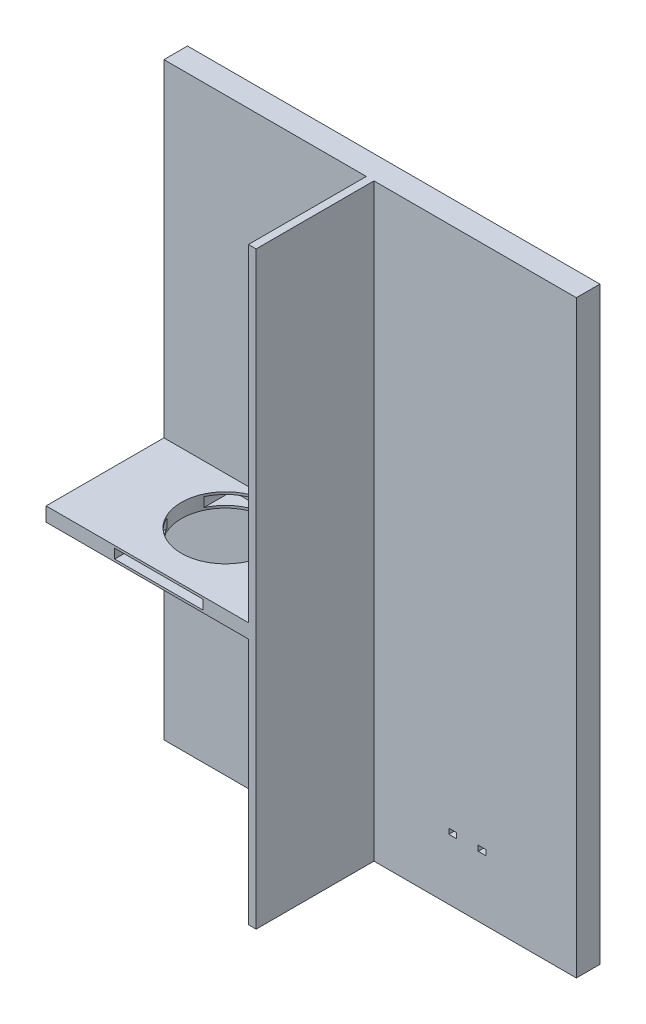
ISO-10303-21;
HEADER;
FILE_DESCRIPTION(('STEP AP214'),'2;1');
FILE_NAME('part.step','',(''),(''),'','','');
FILE_SCHEMA(('AUTOMOTIVE_DESIGN { 1 0 10303 214 1 1 1 1 }'));
ENDSEC;
DATA;
#1=APPLICATION_CONTEXT('core data for automotive mechanical design processes');
#2=APPLICATION_PROTOCOL_DEFINITION('international standard','automotive_design',2000,#1);
#3=PRODUCT_CONTEXT('',#1,'mechanical');
#4=PRODUCT('Part','Part','',(#3));
#5=PRODUCT_RELATED_PRODUCT_CATEGORY('part','',(#4));
#6=PRODUCT_DEFINITION_FORMATION('','',#4);
#7=PRODUCT_DEFINITION_CONTEXT('part definition',#1,'design');
#8=PRODUCT_DEFINITION('design','',#6,#7);
#9=PRODUCT_DEFINITION_SHAPE('','',#8);
#10=(LENGTH_UNIT() NAMED_UNIT(*) SI_UNIT(.MILLI.,.METRE.));
#11=(NAMED_UNIT(*) PLANE_ANGLE_UNIT() SI_UNIT($,.RADIAN.));
#12=(NAMED_UNIT(*) SI_UNIT($,.STERADIAN.) SOLID_ANGLE_UNIT());
#13=UNCERTAINTY_MEASURE_WITH_UNIT(LENGTH_MEASURE(1.E-05),#10,'distance_accuracy_value','');
#14=(GEOMETRIC_REPRESENTATION_CONTEXT(3) GLOBAL_UNCERTAINTY_ASSIGNED_CONTEXT((#13)) GLOBAL_UNIT_ASSIGNED_CONTEXT((#10,
#11,#12)) REPRESENTATION_CONTEXT('',''));
#15=CARTESIAN_POINT('',(0.,0.,0.));
#16=DIRECTION('',(0.,0.,1.));
#17=DIRECTION('',(1.,0.,0.));
#18=AXIS2_PLACEMENT_3D('',#15,#16,#17);
#19=CARTESIAN_POINT('',(5.82,21.2,2.));
#20=DIRECTION('',(-1.,0.,0.));
#21=DIRECTION('',(0.,0.,1.));
#22=AXIS2_PLACEMENT_3D('',#19,#20,#21);
#23=PLANE('',#22);
#24=DIRECTION('',(0.,0.,1.));
#25=VECTOR('',#24,1.);
#26=CARTESIAN_POINT('',(5.82,22.,2.));
#27=LINE('',#26,#25);
#28=CARTESIAN_POINT('',(5.82,22.,2.));
#29=VERTEX_POINT('',#28);
#30=CARTESIAN_POINT('',(5.82,22.,4.42851427794878));
#31=VERTEX_POINT('',#30);
#32=EDGE_CURVE('E273',#29,#31,#27,.T.);
#33=ORIENTED_EDGE('',*,*,#32,.T.);
#34=DIRECTION('',(0.,-1.,0.));
#35=VECTOR('',#34,1.);
#36=CARTESIAN_POINT('',(5.82,50.001,4.42851427794878));
#37=LINE('',#36,#35);
#38=CARTESIAN_POINT('',(5.82,21.2,4.42851427794879));
#39=VERTEX_POINT('',#38);
#40=EDGE_CURVE('E262',#39,#31,#37,.F.);
#41=ORIENTED_EDGE('',*,*,#40,.F.);
#42=DIRECTION('',(0.,0.,1.));
#43=VECTOR('',#42,1.);
#44=CARTESIAN_POINT('',(5.82,21.2,2.));
#45=LINE('',#44,#43);
#46=CARTESIAN_POINT('',(5.82,21.2,2.));
#47=VERTEX_POINT('',#46);
#48=EDGE_CURVE('E271',#47,#39,#45,.T.);
#49=ORIENTED_EDGE('',*,*,#48,.F.);
#50=DIRECTION('',(0.,-1.,0.));
#51=VECTOR('',#50,1.);
#52=CARTESIAN_POINT('',(5.82,21.2,2.));
#53=LINE('',#52,#51);
#54=EDGE_CURVE('E615',#29,#47,#53,.T.);
#55=ORIENTED_EDGE('',*,*,#54,.F.);
#56=EDGE_LOOP('',(#33,#41,#49,#55));
#57=FACE_BOUND('',#56,.T.);
#58=ADVANCED_FACE('F38',(#57),#23,.F.);
#59=CARTESIAN_POINT('',(0.,0.,2.));
#60=DIRECTION('',(0.,0.,-1.));
#61=DIRECTION('',(-1.,0.,0.));
#62=AXIS2_PLACEMENT_3D('',#59,#60,#61);
#63=PLANE('',#62);
#64=DIRECTION('',(1.,0.,0.));
#65=VECTOR('',#64,1.);
#66=CARTESIAN_POINT('',(0.,22.2,2.));
#67=LINE('',#66,#65);
#68=CARTESIAN_POINT('',(0.,22.2,2.));
#69=VERTEX_POINT('',#68);
#70=CARTESIAN_POINT('',(17.175,22.2,2.));
#71=VERTEX_POINT('',#70);
#72=EDGE_CURVE('E314',#69,#71,#67,.T.);
#73=ORIENTED_EDGE('',*,*,#72,.T.);
#74=DIRECTION('',(0.,-1.,0.));
#75=VECTOR('',#74,1.);
#76=CARTESIAN_POINT('',(17.175,50.,2.));
#77=LINE('',#76,#75);
#78=CARTESIAN_POINT('',(17.175,50.,2.));
#79=VERTEX_POINT('',#78);
#80=EDGE_CURVE('E327',#79,#71,#77,.T.);
#81=ORIENTED_EDGE('',*,*,#80,.F.);
#82=DIRECTION('',(-1.,0.,0.));
#83=VECTOR('',#82,1.);
#84=CARTESIAN_POINT('',(0.,50.,2.));
#85=LINE('',#84,#83);
#86=CARTESIAN_POINT('',(0.,50.,2.));
#87=VERTEX_POINT('',#86);
#88=EDGE_CURVE('E547',#79,#87,#85,.T.);
#89=ORIENTED_EDGE('',*,*,#88,.T.);
#90=DIRECTION('',(0.,-1.,0.));
#91=VECTOR('',#90,1.);
#92=CARTESIAN_POINT('',(0.,0.,2.));
#93=LINE('',#92,#91);
#94=EDGE_CURVE('E534',#87,#69,#93,.T.);
#95=ORIENTED_EDGE('',*,*,#94,.T.);
#96=EDGE_LOOP('',(#73,#81,#89,#95));
#97=FACE_BOUND('',#96,.T.);
#98=ADVANCED_FACE('F595',(#97),#63,.F.);
#99=DIRECTION('',(0.,1.,0.));
#100=VECTOR('',#99,1.);
#101=CARTESIAN_POINT('',(8.6,5.40342989584691,2.));
#102=LINE('',#101,#100);
#103=CARTESIAN_POINT('',(8.6,5.40342989584691,2.));
#104=VERTEX_POINT('',#103);
#105=CARTESIAN_POINT('',(8.6,6.00342989584691,2.));
#106=VERTEX_POINT('',#105);
#107=EDGE_CURVE('E491',#104,#106,#102,.T.);
#108=ORIENTED_EDGE('',*,*,#107,.F.);
#109=DIRECTION('',(1.,0.,0.));
#110=VECTOR('',#109,1.);
#111=CARTESIAN_POINT('',(8.,5.40342989584691,2.));
#112=LINE('',#111,#110);
#113=CARTESIAN_POINT('',(8.,5.40342989584691,2.));
#114=VERTEX_POINT('',#113);
#115=EDGE_CURVE('E502',#114,#104,#112,.T.);
#116=ORIENTED_EDGE('',*,*,#115,.F.);
#117=DIRECTION('',(0.,-1.,0.));
#118=VECTOR('',#117,1.);
#119=CARTESIAN_POINT('',(8.,5.40342989584691,2.));
#120=LINE('',#119,#118);
#121=CARTESIAN_POINT('',(8.,6.00342989584691,2.));
#122=VERTEX_POINT('',#121);
#123=EDGE_CURVE('E498',#122,#114,#120,.T.);
#124=ORIENTED_EDGE('',*,*,#123,.F.);
#125=DIRECTION('',(-1.,0.,0.));
#126=VECTOR('',#125,1.);
#127=CARTESIAN_POINT('',(8.,6.00342989584691,2.));
#128=LINE('',#127,#126);
#129=EDGE_CURVE('E494',#106,#122,#128,.T.);
#130=ORIENTED_EDGE('',*,*,#129,.F.);
#131=EDGE_LOOP('',(#108,#116,#124,#130));
#132=FACE_BOUND('',#131,.T.);
#133=DIRECTION('',(0.,-1.,0.));
#134=VECTOR('',#133,1.);
#135=CARTESIAN_POINT('',(10.54,6.00342989584691,2.));
#136=LINE('',#135,#134);
#137=CARTESIAN_POINT('',(10.54,6.00342989584691,2.));
#138=VERTEX_POINT('',#137);
#139=CARTESIAN_POINT('',(10.54,5.40342989584691,2.));
#140=VERTEX_POINT('',#139);
#141=EDGE_CURVE('E448',#138,#140,#136,.T.);
#142=ORIENTED_EDGE('',*,*,#141,.F.);
#143=DIRECTION('',(-1.,0.,0.));
#144=VECTOR('',#143,1.);
#145=CARTESIAN_POINT('',(11.14,6.00342989584691,2.));
#146=LINE('',#145,#144);
#147=CARTESIAN_POINT('',(11.14,6.00342989584691,2.));
#148=VERTEX_POINT('',#147);
#149=EDGE_CURVE('E459',#148,#138,#146,.T.);
#150=ORIENTED_EDGE('',*,*,#149,.F.);
#151=DIRECTION('',(0.,1.,0.));
#152=VECTOR('',#151,1.);
#153=CARTESIAN_POINT('',(11.14,6.00342989584691,2.));
#154=LINE('',#153,#152);
#155=CARTESIAN_POINT('',(11.14,5.40342989584691,2.));
#156=VERTEX_POINT('',#155);
#157=EDGE_CURVE('E455',#156,#148,#154,.T.);
#158=ORIENTED_EDGE('',*,*,#157,.F.);
#159=DIRECTION('',(1.,0.,0.));
#160=VECTOR('',#159,1.);
#161=CARTESIAN_POINT('',(11.14,5.40342989584691,2.));
#162=LINE('',#161,#160);
#163=EDGE_CURVE('E451',#140,#156,#162,.T.);
#164=ORIENTED_EDGE('',*,*,#163,.F.);
#165=EDGE_LOOP('',(#142,#150,#158,#164));
#166=FACE_BOUND('',#165,.T.);
#167=DIRECTION('',(1.,0.,0.));
#168=VECTOR('',#167,1.);
#169=CARTESIAN_POINT('',(0.,21.,2.));
#170=LINE('',#169,#168);
#171=CARTESIAN_POINT('',(0.,21.,2.));
#172=VERTEX_POINT('',#171);
#173=CARTESIAN_POINT('',(17.175,21.,2.));
#174=VERTEX_POINT('',#173);
#175=EDGE_CURVE('E311',#172,#174,#170,.T.);
#176=ORIENTED_EDGE('',*,*,#175,.F.);
#177=CARTESIAN_POINT('',(0.,0.,2.));
#178=VERTEX_POINT('',#177);
#179=EDGE_CURVE('E539',#172,#178,#93,.T.);
#180=ORIENTED_EDGE('',*,*,#179,.T.);
#181=DIRECTION('',(1.,0.,0.));
#182=VECTOR('',#181,1.);
#183=CARTESIAN_POINT('',(0.,0.,2.));
#184=LINE('',#183,#182);
#185=CARTESIAN_POINT('',(17.175,0.,2.));
#186=VERTEX_POINT('',#185);
#187=EDGE_CURVE('E540',#178,#186,#184,.T.);
#188=ORIENTED_EDGE('',*,*,#187,.T.);
#189=EDGE_CURVE('E342',#174,#186,#77,.T.);
#190=ORIENTED_EDGE('',*,*,#189,.F.);
#191=EDGE_LOOP('',(#176,#180,#188,#190));
#192=FACE_BOUND('',#191,.T.);
#193=ADVANCED_FACE('F685',(#132,#166,#192),#63,.F.);
#194=CARTESIAN_POINT('',(17.175,50.,12.));
#195=DIRECTION('',(1.,0.,0.));
#196=DIRECTION('',(0.,1.,0.));
#197=AXIS2_PLACEMENT_3D('',#194,#195,#196);
#198=PLANE('',#197);
#199=DIRECTION('',(0.,0.,-1.));
#200=VECTOR('',#199,1.);
#201=CARTESIAN_POINT('',(17.175,22.2,12.));
#202=LINE('',#201,#200);
#203=CARTESIAN_POINT('',(17.175,22.2,12.));
#204=VERTEX_POINT('',#203);
#205=EDGE_CURVE('E303',#204,#71,#202,.T.);
#206=ORIENTED_EDGE('',*,*,#205,.F.);
#207=DIRECTION('',(0.,-1.,0.));
#208=VECTOR('',#207,1.);
#209=CARTESIAN_POINT('',(17.175,50.,12.));
#210=LINE('',#209,#208);
#211=CARTESIAN_POINT('',(17.175,50.,12.));
#212=VERTEX_POINT('',#211);
#213=EDGE_CURVE('E331',#212,#204,#210,.T.);
#214=ORIENTED_EDGE('',*,*,#213,.F.);
#215=DIRECTION('',(0.,0.,-1.));
#216=VECTOR('',#215,1.);
#217=CARTESIAN_POINT('',(17.175,50.,12.));
#218=LINE('',#217,#216);
#219=EDGE_CURVE('E353',#212,#79,#218,.T.);
#220=ORIENTED_EDGE('',*,*,#219,.T.);
#221=ORIENTED_EDGE('',*,*,#80,.T.);
#222=EDGE_LOOP('',(#206,#214,#220,#221));
#223=FACE_BOUND('',#222,.T.);
#224=ADVANCED_FACE('F681',(#223),#198,.F.);
#225=DIRECTION('',(0.,0.,1.));
#226=VECTOR('',#225,1.);
#227=CARTESIAN_POINT('',(17.175,21.,12.));
#228=LINE('',#227,#226);
#229=CARTESIAN_POINT('',(17.175,21.,12.));
#230=VERTEX_POINT('',#229);
#231=EDGE_CURVE('E296',#174,#230,#228,.T.);
#232=ORIENTED_EDGE('',*,*,#231,.F.);
#233=ORIENTED_EDGE('',*,*,#189,.T.);
#234=DIRECTION('',(0.,0.,-1.));
#235=VECTOR('',#234,1.);
#236=CARTESIAN_POINT('',(17.175,0.,12.));
#237=LINE('',#236,#235);
#238=CARTESIAN_POINT('',(17.175,0.,12.));
#239=VERTEX_POINT('',#238);
#240=EDGE_CURVE('E349',#239,#186,#237,.T.);
#241=ORIENTED_EDGE('',*,*,#240,.F.);
#242=EDGE_CURVE('E330',#230,#239,#210,.T.);
#243=ORIENTED_EDGE('',*,*,#242,.F.);
#244=EDGE_LOOP('',(#232,#233,#241,#243));
#245=FACE_BOUND('',#244,.T.);
#246=ADVANCED_FACE('F684',(#245),#198,.F.);
#247=DIRECTION('',(0.,-1.,0.));
#248=VECTOR('',#247,1.);
#249=CARTESIAN_POINT('',(24.175,5.15,2.));
#250=LINE('',#249,#248);
#251=CARTESIAN_POINT('',(24.175,5.6,2.));
#252=VERTEX_POINT('',#251);
#253=CARTESIAN_POINT('',(24.175,5.15,2.));
#254=VERTEX_POINT('',#253);
#255=EDGE_CURVE('E362',#252,#254,#250,.T.);
#256=ORIENTED_EDGE('',*,*,#255,.F.);
#257=DIRECTION('',(-1.,0.,0.));
#258=VECTOR('',#257,1.);
#259=CARTESIAN_POINT('',(24.825,5.6,2.));
#260=LINE('',#259,#258);
#261=CARTESIAN_POINT('',(24.825,5.6,2.));
#262=VERTEX_POINT('',#261);
#263=EDGE_CURVE('E373',#262,#252,#260,.T.);
#264=ORIENTED_EDGE('',*,*,#263,.F.);
#265=DIRECTION('',(0.,1.,0.));
#266=VECTOR('',#265,1.);
#267=CARTESIAN_POINT('',(24.825,5.15,2.));
#268=LINE('',#267,#266);
#269=CARTESIAN_POINT('',(24.825,5.15,2.));
#270=VERTEX_POINT('',#269);
#271=EDGE_CURVE('E369',#270,#262,#268,.T.);
#272=ORIENTED_EDGE('',*,*,#271,.F.);
#273=DIRECTION('',(1.,0.,0.));
#274=VECTOR('',#273,1.);
#275=CARTESIAN_POINT('',(24.825,5.15,2.));
#276=LINE('',#275,#274);
#277=EDGE_CURVE('E365',#254,#270,#276,.T.);
#278=ORIENTED_EDGE('',*,*,#277,.F.);
#279=EDGE_LOOP('',(#256,#264,#272,#278));
#280=FACE_BOUND('',#279,.T.);
#281=DIRECTION('',(0.,-1.,0.));
#282=VECTOR('',#281,1.);
#283=CARTESIAN_POINT('',(26.675,5.6,2.));
#284=LINE('',#283,#282);
#285=CARTESIAN_POINT('',(26.675,5.6,2.));
#286=VERTEX_POINT('',#285);
#287=CARTESIAN_POINT('',(26.675,5.15,2.));
#288=VERTEX_POINT('',#287);
#289=EDGE_CURVE('E405',#286,#288,#284,.T.);
#290=ORIENTED_EDGE('',*,*,#289,.F.);
#291=DIRECTION('',(-1.,0.,0.));
#292=VECTOR('',#291,1.);
#293=CARTESIAN_POINT('',(27.325,5.6,2.));
#294=LINE('',#293,#292);
#295=CARTESIAN_POINT('',(27.325,5.6,2.));
#296=VERTEX_POINT('',#295);
#297=EDGE_CURVE('E416',#296,#286,#294,.T.);
#298=ORIENTED_EDGE('',*,*,#297,.F.);
#299=DIRECTION('',(0.,1.,0.));
#300=VECTOR('',#299,1.);
#301=CARTESIAN_POINT('',(27.325,5.6,2.));
#302=LINE('',#301,#300);
#303=CARTESIAN_POINT('',(27.325,5.15,2.));
#304=VERTEX_POINT('',#303);
#305=EDGE_CURVE('E412',#304,#296,#302,.T.);
#306=ORIENTED_EDGE('',*,*,#305,.F.);
#307=DIRECTION('',(1.,0.,0.));
#308=VECTOR('',#307,1.);
#309=CARTESIAN_POINT('',(27.325,5.15,2.));
#310=LINE('',#309,#308);
#311=EDGE_CURVE('E408',#288,#304,#310,.T.);
#312=ORIENTED_EDGE('',*,*,#311,.F.);
#313=EDGE_LOOP('',(#290,#298,#306,#312));
#314=FACE_BOUND('',#313,.T.);
#315=DIRECTION('',(0.,1.,0.));
#316=VECTOR('',#315,1.);
#317=CARTESIAN_POINT('',(17.825,50.,2.));
#318=LINE('',#317,#316);
#319=CARTESIAN_POINT('',(17.825,0.,2.));
#320=VERTEX_POINT('',#319);
#321=CARTESIAN_POINT('',(17.825,50.,2.));
#322=VERTEX_POINT('',#321);
#323=EDGE_CURVE('E321',#320,#322,#318,.T.);
#324=ORIENTED_EDGE('',*,*,#323,.F.);
#325=CARTESIAN_POINT('',(35.,0.,2.));
#326=VERTEX_POINT('',#325);
#327=EDGE_CURVE('E538',#320,#326,#184,.T.);
#328=ORIENTED_EDGE('',*,*,#327,.T.);
#329=DIRECTION('',(0.,1.,0.));
#330=VECTOR('',#329,1.);
#331=CARTESIAN_POINT('',(35.,0.,2.));
#332=LINE('',#331,#330);
#333=CARTESIAN_POINT('',(35.,50.,2.));
#334=VERTEX_POINT('',#333);
#335=EDGE_CURVE('E544',#326,#334,#332,.T.);
#336=ORIENTED_EDGE('',*,*,#335,.T.);
#337=EDGE_CURVE('E548',#334,#322,#85,.T.);
#338=ORIENTED_EDGE('',*,*,#337,.T.);
#339=EDGE_LOOP('',(#324,#328,#336,#338));
#340=FACE_BOUND('',#339,.T.);
#341=ADVANCED_FACE('F754',(#280,#314,#340),#63,.F.);
#342=CARTESIAN_POINT('',(0.,0.,0.));
#343=DIRECTION('',(0.,0.,-1.));
#344=DIRECTION('',(-1.,0.,0.));
#345=AXIS2_PLACEMENT_3D('',#342,#343,#344);
#346=PLANE('',#345);
#347=DIRECTION('',(0.,-1.,0.));
#348=VECTOR('',#347,1.);
#349=CARTESIAN_POINT('',(0.,0.,0.));
#350=LINE('',#349,#348);
#351=CARTESIAN_POINT('',(0.,50.,0.));
#352=VERTEX_POINT('',#351);
#353=CARTESIAN_POINT('',(0.,0.,0.));
#354=VERTEX_POINT('',#353);
#355=EDGE_CURVE('E533',#352,#354,#350,.T.);
#356=ORIENTED_EDGE('',*,*,#355,.F.);
#357=DIRECTION('',(-1.,0.,0.));
#358=VECTOR('',#357,1.);
#359=CARTESIAN_POINT('',(0.,50.,0.));
#360=LINE('',#359,#358);
#361=CARTESIAN_POINT('',(35.,50.,0.));
#362=VERTEX_POINT('',#361);
#363=EDGE_CURVE('E561',#362,#352,#360,.T.);
#364=ORIENTED_EDGE('',*,*,#363,.F.);
#365=DIRECTION('',(0.,1.,0.));
#366=VECTOR('',#365,1.);
#367=CARTESIAN_POINT('',(35.,0.,0.));
#368=LINE('',#367,#366);
#369=CARTESIAN_POINT('',(35.,0.,0.));
#370=VERTEX_POINT('',#369);
#371=EDGE_CURVE('E558',#370,#362,#368,.T.);
#372=ORIENTED_EDGE('',*,*,#371,.F.);
#373=DIRECTION('',(1.,0.,0.));
#374=VECTOR('',#373,1.);
#375=CARTESIAN_POINT('',(0.,0.,0.));
#376=LINE('',#375,#374);
#377=EDGE_CURVE('E555',#354,#370,#376,.T.);
#378=ORIENTED_EDGE('',*,*,#377,.F.);
#379=EDGE_LOOP('',(#356,#364,#372,#378));
#380=FACE_BOUND('',#379,.T.);
#381=DIRECTION('',(1.,0.,0.));
#382=VECTOR('',#381,1.);
#383=CARTESIAN_POINT('',(8.,5.40342989584691,0.));
#384=LINE('',#383,#382);
#385=CARTESIAN_POINT('',(8.,5.40342989584691,0.));
#386=VERTEX_POINT('',#385);
#387=CARTESIAN_POINT('',(8.6,5.40342989584691,0.));
#388=VERTEX_POINT('',#387);
#389=EDGE_CURVE('E495',#386,#388,#384,.T.);
#390=ORIENTED_EDGE('',*,*,#389,.T.);
#391=DIRECTION('',(0.,1.,0.));
#392=VECTOR('',#391,1.);
#393=CARTESIAN_POINT('',(8.6,5.40342989584691,0.));
#394=LINE('',#393,#392);
#395=CARTESIAN_POINT('',(8.6,6.00342989584691,0.));
#396=VERTEX_POINT('',#395);
#397=EDGE_CURVE('E490',#388,#396,#394,.T.);
#398=ORIENTED_EDGE('',*,*,#397,.T.);
#399=DIRECTION('',(-1.,0.,0.));
#400=VECTOR('',#399,1.);
#401=CARTESIAN_POINT('',(8.,6.00342989584691,0.));
#402=LINE('',#401,#400);
#403=CARTESIAN_POINT('',(8.,6.00342989584691,0.));
#404=VERTEX_POINT('',#403);
#405=EDGE_CURVE('E509',#396,#404,#402,.T.);
#406=ORIENTED_EDGE('',*,*,#405,.T.);
#407=DIRECTION('',(0.,-1.,0.));
#408=VECTOR('',#407,1.);
#409=CARTESIAN_POINT('',(8.,5.40342989584691,0.));
#410=LINE('',#409,#408);
#411=EDGE_CURVE('E513',#404,#386,#410,.T.);
#412=ORIENTED_EDGE('',*,*,#411,.T.);
#413=EDGE_LOOP('',(#390,#398,#406,#412));
#414=FACE_BOUND('',#413,.T.);
#415=DIRECTION('',(-1.,0.,0.));
#416=VECTOR('',#415,1.);
#417=CARTESIAN_POINT('',(11.14,6.00342989584691,0.));
#418=LINE('',#417,#416);
#419=CARTESIAN_POINT('',(11.14,6.00342989584691,0.));
#420=VERTEX_POINT('',#419);
#421=CARTESIAN_POINT('',(10.54,6.00342989584691,0.));
#422=VERTEX_POINT('',#421);
#423=EDGE_CURVE('E452',#420,#422,#418,.T.);
#424=ORIENTED_EDGE('',*,*,#423,.T.);
#425=DIRECTION('',(0.,-1.,0.));
#426=VECTOR('',#425,1.);
#427=CARTESIAN_POINT('',(10.54,6.00342989584691,0.));
#428=LINE('',#427,#426);
#429=CARTESIAN_POINT('',(10.54,5.40342989584691,0.));
#430=VERTEX_POINT('',#429);
#431=EDGE_CURVE('E447',#422,#430,#428,.T.);
#432=ORIENTED_EDGE('',*,*,#431,.T.);
#433=DIRECTION('',(1.,0.,0.));
#434=VECTOR('',#433,1.);
#435=CARTESIAN_POINT('',(11.14,5.40342989584691,0.));
#436=LINE('',#435,#434);
#437=CARTESIAN_POINT('',(11.14,5.40342989584691,0.));
#438=VERTEX_POINT('',#437);
#439=EDGE_CURVE('E466',#430,#438,#436,.T.);
#440=ORIENTED_EDGE('',*,*,#439,.T.);
#441=DIRECTION('',(0.,1.,0.));
#442=VECTOR('',#441,1.);
#443=CARTESIAN_POINT('',(11.14,6.00342989584691,0.));
#444=LINE('',#443,#442);
#445=EDGE_CURVE('E470',#438,#420,#444,.T.);
#446=ORIENTED_EDGE('',*,*,#445,.T.);
#447=EDGE_LOOP('',(#424,#432,#440,#446));
#448=FACE_BOUND('',#447,.T.);
#449=DIRECTION('',(-1.,0.,0.));
#450=VECTOR('',#449,1.);
#451=CARTESIAN_POINT('',(27.325,5.6,0.));
#452=LINE('',#451,#450);
#453=CARTESIAN_POINT('',(27.325,5.6,0.));
#454=VERTEX_POINT('',#453);
#455=CARTESIAN_POINT('',(26.675,5.6,0.));
#456=VERTEX_POINT('',#455);
#457=EDGE_CURVE('E409',#454,#456,#452,.T.);
#458=ORIENTED_EDGE('',*,*,#457,.T.);
#459=DIRECTION('',(0.,-1.,0.));
#460=VECTOR('',#459,1.);
#461=CARTESIAN_POINT('',(26.675,5.6,0.));
#462=LINE('',#461,#460);
#463=CARTESIAN_POINT('',(26.675,5.15,0.));
#464=VERTEX_POINT('',#463);
#465=EDGE_CURVE('E404',#456,#464,#462,.T.);
#466=ORIENTED_EDGE('',*,*,#465,.T.);
#467=DIRECTION('',(1.,0.,0.));
#468=VECTOR('',#467,1.);
#469=CARTESIAN_POINT('',(27.325,5.15,0.));
#470=LINE('',#469,#468);
#471=CARTESIAN_POINT('',(27.325,5.15,0.));
#472=VERTEX_POINT('',#471);
#473=EDGE_CURVE('E423',#464,#472,#470,.T.);
#474=ORIENTED_EDGE('',*,*,#473,.T.);
#475=DIRECTION('',(0.,1.,0.));
#476=VECTOR('',#475,1.);
#477=CARTESIAN_POINT('',(27.325,5.6,0.));
#478=LINE('',#477,#476);
#479=EDGE_CURVE('E427',#472,#454,#478,.T.);
#480=ORIENTED_EDGE('',*,*,#479,.T.);
#481=EDGE_LOOP('',(#458,#466,#474,#480));
#482=FACE_BOUND('',#481,.T.);
#483=DIRECTION('',(-1.,0.,0.));
#484=VECTOR('',#483,1.);
#485=CARTESIAN_POINT('',(24.825,5.6,0.));
#486=LINE('',#485,#484);
#487=CARTESIAN_POINT('',(24.825,5.6,0.));
#488=VERTEX_POINT('',#487);
#489=CARTESIAN_POINT('',(24.175,5.6,0.));
#490=VERTEX_POINT('',#489);
#491=EDGE_CURVE('E366',#488,#490,#486,.T.);
#492=ORIENTED_EDGE('',*,*,#491,.T.);
#493=DIRECTION('',(0.,-1.,0.));
#494=VECTOR('',#493,1.);
#495=CARTESIAN_POINT('',(24.175,5.15,0.));
#496=LINE('',#495,#494);
#497=CARTESIAN_POINT('',(24.175,5.15,0.));
#498=VERTEX_POINT('',#497);
#499=EDGE_CURVE('E361',#490,#498,#496,.T.);
#500=ORIENTED_EDGE('',*,*,#499,.T.);
#501=DIRECTION('',(1.,0.,0.));
#502=VECTOR('',#501,1.);
#503=CARTESIAN_POINT('',(24.825,5.15,0.));
#504=LINE('',#503,#502);
#505=CARTESIAN_POINT('',(24.825,5.15,0.));
#506=VERTEX_POINT('',#505);
#507=EDGE_CURVE('E380',#498,#506,#504,.T.);
#508=ORIENTED_EDGE('',*,*,#507,.T.);
#509=DIRECTION('',(0.,1.,0.));
#510=VECTOR('',#509,1.);
#511=CARTESIAN_POINT('',(24.825,5.15,0.));
#512=LINE('',#511,#510);
#513=EDGE_CURVE('E384',#506,#488,#512,.T.);
#514=ORIENTED_EDGE('',*,*,#513,.T.);
#515=EDGE_LOOP('',(#492,#500,#508,#514));
#516=FACE_BOUND('',#515,.T.);
#517=ADVANCED_FACE('F583',(#380,#414,#448,#482,#516),#346,.T.);
#518=CARTESIAN_POINT('',(0.,0.,2.));
#519=DIRECTION('',(1.,0.,0.));
#520=DIRECTION('',(0.,0.,-1.));
#521=AXIS2_PLACEMENT_3D('',#518,#519,#520);
#522=PLANE('',#521);
#523=ORIENTED_EDGE('',*,*,#355,.T.);
#524=DIRECTION('',(0.,0.,-1.));
#525=VECTOR('',#524,1.);
#526=CARTESIAN_POINT('',(0.,0.,2.));
#527=LINE('',#526,#525);
#528=EDGE_CURVE('E11',#178,#354,#527,.T.);
#529=ORIENTED_EDGE('',*,*,#528,.F.);
#530=ORIENTED_EDGE('',*,*,#179,.F.);
#531=DIRECTION('',(0.,0.,1.));
#532=VECTOR('',#531,1.);
#533=CARTESIAN_POINT('',(0.,21.,12.));
#534=LINE('',#533,#532);
#535=CARTESIAN_POINT('',(0.,21.,12.));
#536=VERTEX_POINT('',#535);
#537=EDGE_CURVE('E299',#172,#536,#534,.T.);
#538=ORIENTED_EDGE('',*,*,#537,.T.);
#539=DIRECTION('',(0.,1.,0.));
#540=VECTOR('',#539,1.);
#541=CARTESIAN_POINT('',(0.,21.,12.));
#542=LINE('',#541,#540);
#543=CARTESIAN_POINT('',(0.,22.2,12.));
#544=VERTEX_POINT('',#543);
#545=EDGE_CURVE('E291',#536,#544,#542,.T.);
#546=ORIENTED_EDGE('',*,*,#545,.T.);
#547=DIRECTION('',(0.,0.,-1.));
#548=VECTOR('',#547,1.);
#549=CARTESIAN_POINT('',(0.,22.2,12.));
#550=LINE('',#549,#548);
#551=EDGE_CURVE('E295',#544,#69,#550,.T.);
#552=ORIENTED_EDGE('',*,*,#551,.T.);
#553=ORIENTED_EDGE('',*,*,#94,.F.);
#554=DIRECTION('',(0.,0.,-1.));
#555=VECTOR('',#554,1.);
#556=CARTESIAN_POINT('',(0.,50.,2.));
#557=LINE('',#556,#555);
#558=EDGE_CURVE('E551',#87,#352,#557,.T.);
#559=ORIENTED_EDGE('',*,*,#558,.T.);
#560=EDGE_LOOP('',(#523,#529,#530,#538,#546,#552,#553,#559));
#561=FACE_BOUND('',#560,.T.);
#562=ADVANCED_FACE('F40',(#561),#522,.F.);
#563=CARTESIAN_POINT('',(0.,0.,2.));
#564=DIRECTION('',(0.,1.,0.));
#565=DIRECTION('',(0.,0.,1.));
#566=AXIS2_PLACEMENT_3D('',#563,#564,#565);
#567=PLANE('',#566);
#568=ORIENTED_EDGE('',*,*,#377,.T.);
#569=DIRECTION('',(0.,0.,-1.));
#570=VECTOR('',#569,1.);
#571=CARTESIAN_POINT('',(35.,0.,2.));
#572=LINE('',#571,#570);
#573=EDGE_CURVE('E47',#326,#370,#572,.T.);
#574=ORIENTED_EDGE('',*,*,#573,.F.);
#575=ORIENTED_EDGE('',*,*,#327,.F.);
#576=DIRECTION('',(0.,0.,-1.));
#577=VECTOR('',#576,1.);
#578=CARTESIAN_POINT('',(17.825,0.,12.));
#579=LINE('',#578,#577);
#580=CARTESIAN_POINT('',(17.825,0.,12.));
#581=VERTEX_POINT('',#580);
#582=EDGE_CURVE('E338',#581,#320,#579,.T.);
#583=ORIENTED_EDGE('',*,*,#582,.F.);
#584=DIRECTION('',(1.,0.,0.));
#585=VECTOR('',#584,1.);
#586=CARTESIAN_POINT('',(17.175,0.,12.));
#587=LINE('',#586,#585);
#588=EDGE_CURVE('E335',#239,#581,#587,.T.);
#589=ORIENTED_EDGE('',*,*,#588,.F.);
#590=ORIENTED_EDGE('',*,*,#240,.T.);
#591=ORIENTED_EDGE('',*,*,#187,.F.);
#592=ORIENTED_EDGE('',*,*,#528,.T.);
#593=EDGE_LOOP('',(#568,#574,#575,#583,#589,#590,#591,#592));
#594=FACE_BOUND('',#593,.T.);
#595=ADVANCED_FACE('F763',(#594),#567,.F.);
#596=CARTESIAN_POINT('',(35.,0.,2.));
#597=DIRECTION('',(-1.,0.,0.));
#598=DIRECTION('',(0.,0.,1.));
#599=AXIS2_PLACEMENT_3D('',#596,#597,#598);
#600=PLANE('',#599);
#601=ORIENTED_EDGE('',*,*,#371,.T.);
#602=DIRECTION('',(0.,0.,-1.));
#603=VECTOR('',#602,1.);
#604=CARTESIAN_POINT('',(35.,50.,2.));
#605=LINE('',#604,#603);
#606=EDGE_CURVE('E567',#334,#362,#605,.T.);
#607=ORIENTED_EDGE('',*,*,#606,.F.);
#608=ORIENTED_EDGE('',*,*,#335,.F.);
#609=ORIENTED_EDGE('',*,*,#573,.T.);
#610=EDGE_LOOP('',(#601,#607,#608,#609));
#611=FACE_BOUND('',#610,.T.);
#612=ADVANCED_FACE('F576',(#611),#600,.F.);
#613=CARTESIAN_POINT('',(0.,50.,2.));
#614=DIRECTION('',(0.,-1.,0.));
#615=DIRECTION('',(0.,0.,-1.));
#616=AXIS2_PLACEMENT_3D('',#613,#614,#615);
#617=PLANE('',#616);
#618=ORIENTED_EDGE('',*,*,#363,.T.);
#619=ORIENTED_EDGE('',*,*,#558,.F.);
#620=ORIENTED_EDGE('',*,*,#88,.F.);
#621=ORIENTED_EDGE('',*,*,#219,.F.);
#622=DIRECTION('',(-1.,0.,0.));
#623=VECTOR('',#622,1.);
#624=CARTESIAN_POINT('',(17.175,50.,12.));
#625=LINE('',#624,#623);
#626=CARTESIAN_POINT('',(17.825,50.,12.));
#627=VERTEX_POINT('',#626);
#628=EDGE_CURVE('E326',#627,#212,#625,.T.);
#629=ORIENTED_EDGE('',*,*,#628,.F.);
#630=DIRECTION('',(0.,0.,-1.));
#631=VECTOR('',#630,1.);
#632=CARTESIAN_POINT('',(17.825,50.,12.));
#633=LINE('',#632,#631);
#634=EDGE_CURVE('E357',#627,#322,#633,.T.);
#635=ORIENTED_EDGE('',*,*,#634,.T.);
#636=ORIENTED_EDGE('',*,*,#337,.F.);
#637=ORIENTED_EDGE('',*,*,#606,.T.);
#638=EDGE_LOOP('',(#618,#619,#620,#621,#629,#635,#636,#637));
#639=FACE_BOUND('',#638,.T.);
#640=ADVANCED_FACE('F587',(#639),#617,.F.);
#641=CARTESIAN_POINT('',(8.6,5.40342989584691,2.));
#642=DIRECTION('',(-1.,0.,0.));
#643=DIRECTION('',(0.,0.,1.));
#644=AXIS2_PLACEMENT_3D('',#641,#642,#643);
#645=PLANE('',#644);
#646=ORIENTED_EDGE('',*,*,#397,.F.);
#647=DIRECTION('',(0.,0.,-1.));
#648=VECTOR('',#647,1.);
#649=CARTESIAN_POINT('',(8.6,5.40342989584691,2.));
#650=LINE('',#649,#648);
#651=EDGE_CURVE('E505',#104,#388,#650,.T.);
#652=ORIENTED_EDGE('',*,*,#651,.F.);
#653=ORIENTED_EDGE('',*,*,#107,.T.);
#654=DIRECTION('',(0.,0.,-1.));
#655=VECTOR('',#654,1.);
#656=CARTESIAN_POINT('',(8.6,6.00342989584691,2.));
#657=LINE('',#656,#655);
#658=EDGE_CURVE('E529',#106,#396,#657,.T.);
#659=ORIENTED_EDGE('',*,*,#658,.T.);
#660=EDGE_LOOP('',(#646,#652,#653,#659));
#661=FACE_BOUND('',#660,.T.);
#662=ADVANCED_FACE('F749',(#661),#645,.T.);
#663=CARTESIAN_POINT('',(8.,6.00342989584691,2.));
#664=DIRECTION('',(0.,-1.,0.));
#665=DIRECTION('',(0.,0.,-1.));
#666=AXIS2_PLACEMENT_3D('',#663,#664,#665);
#667=PLANE('',#666);
#668=ORIENTED_EDGE('',*,*,#405,.F.);
#669=ORIENTED_EDGE('',*,*,#658,.F.);
#670=ORIENTED_EDGE('',*,*,#129,.T.);
#671=DIRECTION('',(0.,0.,-1.));
#672=VECTOR('',#671,1.);
#673=CARTESIAN_POINT('',(8.,6.00342989584691,2.));
#674=LINE('',#673,#672);
#675=EDGE_CURVE('E526',#122,#404,#674,.T.);
#676=ORIENTED_EDGE('',*,*,#675,.T.);
#677=EDGE_LOOP('',(#668,#669,#670,#676));
#678=FACE_BOUND('',#677,.T.);
#679=ADVANCED_FACE('F745',(#678),#667,.T.);
#680=CARTESIAN_POINT('',(8.,5.40342989584691,2.));
#681=DIRECTION('',(1.,0.,0.));
#682=DIRECTION('',(0.,0.,-1.));
#683=AXIS2_PLACEMENT_3D('',#680,#681,#682);
#684=PLANE('',#683);
#685=ORIENTED_EDGE('',*,*,#411,.F.);
#686=ORIENTED_EDGE('',*,*,#675,.F.);
#687=ORIENTED_EDGE('',*,*,#123,.T.);
#688=DIRECTION('',(0.,0.,-1.));
#689=VECTOR('',#688,1.);
#690=CARTESIAN_POINT('',(8.,5.40342989584691,2.));
#691=LINE('',#690,#689);
#692=EDGE_CURVE('E523',#114,#386,#691,.T.);
#693=ORIENTED_EDGE('',*,*,#692,.T.);
#694=EDGE_LOOP('',(#685,#686,#687,#693));
#695=FACE_BOUND('',#694,.T.);
#696=ADVANCED_FACE('F741',(#695),#684,.T.);
#697=CARTESIAN_POINT('',(8.,5.40342989584691,2.));
#698=DIRECTION('',(0.,1.,0.));
#699=DIRECTION('',(0.,0.,1.));
#700=AXIS2_PLACEMENT_3D('',#697,#698,#699);
#701=PLANE('',#700);
#702=ORIENTED_EDGE('',*,*,#389,.F.);
#703=ORIENTED_EDGE('',*,*,#692,.F.);
#704=ORIENTED_EDGE('',*,*,#115,.T.);
#705=ORIENTED_EDGE('',*,*,#651,.T.);
#706=EDGE_LOOP('',(#702,#703,#704,#705));
#707=FACE_BOUND('',#706,.T.);
#708=ADVANCED_FACE('F737',(#707),#701,.T.);
#709=CARTESIAN_POINT('',(10.54,6.00342989584691,2.));
#710=DIRECTION('',(1.,0.,0.));
#711=DIRECTION('',(0.,0.,-1.));
#712=AXIS2_PLACEMENT_3D('',#709,#710,#711);
#713=PLANE('',#712);
#714=ORIENTED_EDGE('',*,*,#431,.F.);
#715=DIRECTION('',(0.,0.,-1.));
#716=VECTOR('',#715,1.);
#717=CARTESIAN_POINT('',(10.54,6.00342989584691,2.));
#718=LINE('',#717,#716);
#719=EDGE_CURVE('E462',#138,#422,#718,.T.);
#720=ORIENTED_EDGE('',*,*,#719,.F.);
#721=ORIENTED_EDGE('',*,*,#141,.T.);
#722=DIRECTION('',(0.,0.,-1.));
#723=VECTOR('',#722,1.);
#724=CARTESIAN_POINT('',(10.54,5.40342989584691,2.));
#725=LINE('',#724,#723);
#726=EDGE_CURVE('E486',#140,#430,#725,.T.);
#727=ORIENTED_EDGE('',*,*,#726,.T.);
#728=EDGE_LOOP('',(#714,#720,#721,#727));
#729=FACE_BOUND('',#728,.T.);
#730=ADVANCED_FACE('F733',(#729),#713,.T.);
#731=CARTESIAN_POINT('',(11.14,5.40342989584691,2.));
#732=DIRECTION('',(0.,1.,0.));
#733=DIRECTION('',(0.,0.,1.));
#734=AXIS2_PLACEMENT_3D('',#731,#732,#733);
#735=PLANE('',#734);
#736=ORIENTED_EDGE('',*,*,#439,.F.);
#737=ORIENTED_EDGE('',*,*,#726,.F.);
#738=ORIENTED_EDGE('',*,*,#163,.T.);
#739=DIRECTION('',(0.,0.,-1.));
#740=VECTOR('',#739,1.);
#741=CARTESIAN_POINT('',(11.14,5.40342989584691,2.));
#742=LINE('',#741,#740);
#743=EDGE_CURVE('E483',#156,#438,#742,.T.);
#744=ORIENTED_EDGE('',*,*,#743,.T.);
#745=EDGE_LOOP('',(#736,#737,#738,#744));
#746=FACE_BOUND('',#745,.T.);
#747=ADVANCED_FACE('F729',(#746),#735,.T.);
#748=CARTESIAN_POINT('',(11.14,6.00342989584691,2.));
#749=DIRECTION('',(-1.,0.,0.));
#750=DIRECTION('',(0.,0.,1.));
#751=AXIS2_PLACEMENT_3D('',#748,#749,#750);
#752=PLANE('',#751);
#753=ORIENTED_EDGE('',*,*,#445,.F.);
#754=ORIENTED_EDGE('',*,*,#743,.F.);
#755=ORIENTED_EDGE('',*,*,#157,.T.);
#756=DIRECTION('',(0.,0.,-1.));
#757=VECTOR('',#756,1.);
#758=CARTESIAN_POINT('',(11.14,6.00342989584691,2.));
#759=LINE('',#758,#757);
#760=EDGE_CURVE('E480',#148,#420,#759,.T.);
#761=ORIENTED_EDGE('',*,*,#760,.T.);
#762=EDGE_LOOP('',(#753,#754,#755,#761));
#763=FACE_BOUND('',#762,.T.);
#764=ADVANCED_FACE('F725',(#763),#752,.T.);
#765=CARTESIAN_POINT('',(11.14,6.00342989584691,2.));
#766=DIRECTION('',(0.,-1.,0.));
#767=DIRECTION('',(0.,0.,-1.));
#768=AXIS2_PLACEMENT_3D('',#765,#766,#767);
#769=PLANE('',#768);
#770=ORIENTED_EDGE('',*,*,#423,.F.);
#771=ORIENTED_EDGE('',*,*,#760,.F.);
#772=ORIENTED_EDGE('',*,*,#149,.T.);
#773=ORIENTED_EDGE('',*,*,#719,.T.);
#774=EDGE_LOOP('',(#770,#771,#772,#773));
#775=FACE_BOUND('',#774,.T.);
#776=ADVANCED_FACE('F721',(#775),#769,.T.);
#777=CARTESIAN_POINT('',(26.675,5.6,2.));
#778=DIRECTION('',(1.,0.,0.));
#779=DIRECTION('',(0.,0.,-1.));
#780=AXIS2_PLACEMENT_3D('',#777,#778,#779);
#781=PLANE('',#780);
#782=ORIENTED_EDGE('',*,*,#465,.F.);
#783=DIRECTION('',(0.,0.,-1.));
#784=VECTOR('',#783,1.);
#785=CARTESIAN_POINT('',(26.675,5.6,2.));
#786=LINE('',#785,#784);
#787=EDGE_CURVE('E419',#286,#456,#786,.T.);
#788=ORIENTED_EDGE('',*,*,#787,.F.);
#789=ORIENTED_EDGE('',*,*,#289,.T.);
#790=DIRECTION('',(0.,0.,-1.));
#791=VECTOR('',#790,1.);
#792=CARTESIAN_POINT('',(26.675,5.15,2.));
#793=LINE('',#792,#791);
#794=EDGE_CURVE('E443',#288,#464,#793,.T.);
#795=ORIENTED_EDGE('',*,*,#794,.T.);
#796=EDGE_LOOP('',(#782,#788,#789,#795));
#797=FACE_BOUND('',#796,.T.);
#798=ADVANCED_FACE('F717',(#797),#781,.T.);
#799=CARTESIAN_POINT('',(27.325,5.15,2.));
#800=DIRECTION('',(0.,1.,0.));
#801=DIRECTION('',(0.,0.,1.));
#802=AXIS2_PLACEMENT_3D('',#799,#800,#801);
#803=PLANE('',#802);
#804=ORIENTED_EDGE('',*,*,#473,.F.);
#805=ORIENTED_EDGE('',*,*,#794,.F.);
#806=ORIENTED_EDGE('',*,*,#311,.T.);
#807=DIRECTION('',(0.,0.,-1.));
#808=VECTOR('',#807,1.);
#809=CARTESIAN_POINT('',(27.325,5.15,2.));
#810=LINE('',#809,#808);
#811=EDGE_CURVE('E440',#304,#472,#810,.T.);
#812=ORIENTED_EDGE('',*,*,#811,.T.);
#813=EDGE_LOOP('',(#804,#805,#806,#812));
#814=FACE_BOUND('',#813,.T.);
#815=ADVANCED_FACE('F713',(#814),#803,.T.);
#816=CARTESIAN_POINT('',(27.325,5.6,2.));
#817=DIRECTION('',(-1.,0.,0.));
#818=DIRECTION('',(0.,0.,1.));
#819=AXIS2_PLACEMENT_3D('',#816,#817,#818);
#820=PLANE('',#819);
#821=ORIENTED_EDGE('',*,*,#479,.F.);
#822=ORIENTED_EDGE('',*,*,#811,.F.);
#823=ORIENTED_EDGE('',*,*,#305,.T.);
#824=DIRECTION('',(0.,0.,-1.));
#825=VECTOR('',#824,1.);
#826=CARTESIAN_POINT('',(27.325,5.6,2.));
#827=LINE('',#826,#825);
#828=EDGE_CURVE('E437',#296,#454,#827,.T.);
#829=ORIENTED_EDGE('',*,*,#828,.T.);
#830=EDGE_LOOP('',(#821,#822,#823,#829));
#831=FACE_BOUND('',#830,.T.);
#832=ADVANCED_FACE('F709',(#831),#820,.T.);
#833=CARTESIAN_POINT('',(27.325,5.6,2.));
#834=DIRECTION('',(0.,-1.,0.));
#835=DIRECTION('',(1.,0.,0.));
#836=AXIS2_PLACEMENT_3D('',#833,#834,#835);
#837=PLANE('',#836);
#838=ORIENTED_EDGE('',*,*,#457,.F.);
#839=ORIENTED_EDGE('',*,*,#828,.F.);
#840=ORIENTED_EDGE('',*,*,#297,.T.);
#841=ORIENTED_EDGE('',*,*,#787,.T.);
#842=EDGE_LOOP('',(#838,#839,#840,#841));
#843=FACE_BOUND('',#842,.T.);
#844=ADVANCED_FACE('F705',(#843),#837,.T.);
#845=CARTESIAN_POINT('',(24.175,5.15,2.));
#846=DIRECTION('',(1.,0.,0.));
#847=DIRECTION('',(0.,0.,-1.));
#848=AXIS2_PLACEMENT_3D('',#845,#846,#847);
#849=PLANE('',#848);
#850=ORIENTED_EDGE('',*,*,#499,.F.);
#851=DIRECTION('',(0.,0.,-1.));
#852=VECTOR('',#851,1.);
#853=CARTESIAN_POINT('',(24.175,5.6,2.));
#854=LINE('',#853,#852);
#855=EDGE_CURVE('E376',#252,#490,#854,.T.);
#856=ORIENTED_EDGE('',*,*,#855,.F.);
#857=ORIENTED_EDGE('',*,*,#255,.T.);
#858=DIRECTION('',(0.,0.,-1.));
#859=VECTOR('',#858,1.);
#860=CARTESIAN_POINT('',(24.175,5.15,2.));
#861=LINE('',#860,#859);
#862=EDGE_CURVE('E400',#254,#498,#861,.T.);
#863=ORIENTED_EDGE('',*,*,#862,.T.);
#864=EDGE_LOOP('',(#850,#856,#857,#863));
#865=FACE_BOUND('',#864,.T.);
#866=ADVANCED_FACE('F701',(#865),#849,.T.);
#867=CARTESIAN_POINT('',(24.825,5.15,2.));
#868=DIRECTION('',(0.,1.,0.));
#869=DIRECTION('',(0.,0.,1.));
#870=AXIS2_PLACEMENT_3D('',#867,#868,#869);
#871=PLANE('',#870);
#872=ORIENTED_EDGE('',*,*,#507,.F.);
#873=ORIENTED_EDGE('',*,*,#862,.F.);
#874=ORIENTED_EDGE('',*,*,#277,.T.);
#875=DIRECTION('',(0.,0.,-1.));
#876=VECTOR('',#875,1.);
#877=CARTESIAN_POINT('',(24.825,5.15,2.));
#878=LINE('',#877,#876);
#879=EDGE_CURVE('E397',#270,#506,#878,.T.);
#880=ORIENTED_EDGE('',*,*,#879,.T.);
#881=EDGE_LOOP('',(#872,#873,#874,#880));
#882=FACE_BOUND('',#881,.T.);
#883=ADVANCED_FACE('F697',(#882),#871,.T.);
#884=CARTESIAN_POINT('',(24.825,5.15,2.));
#885=DIRECTION('',(-1.,0.,0.));
#886=DIRECTION('',(0.,0.,1.));
#887=AXIS2_PLACEMENT_3D('',#884,#885,#886);
#888=PLANE('',#887);
#889=ORIENTED_EDGE('',*,*,#513,.F.);
#890=ORIENTED_EDGE('',*,*,#879,.F.);
#891=ORIENTED_EDGE('',*,*,#271,.T.);
#892=DIRECTION('',(0.,0.,-1.));
#893=VECTOR('',#892,1.);
#894=CARTESIAN_POINT('',(24.825,5.6,2.));
#895=LINE('',#894,#893);
#896=EDGE_CURVE('E394',#262,#488,#895,.T.);
#897=ORIENTED_EDGE('',*,*,#896,.T.);
#898=EDGE_LOOP('',(#889,#890,#891,#897));
#899=FACE_BOUND('',#898,.T.);
#900=ADVANCED_FACE('F693',(#899),#888,.T.);
#901=CARTESIAN_POINT('',(24.825,5.6,2.));
#902=DIRECTION('',(0.,-1.,0.));
#903=DIRECTION('',(1.,0.,0.));
#904=AXIS2_PLACEMENT_3D('',#901,#902,#903);
#905=PLANE('',#904);
#906=ORIENTED_EDGE('',*,*,#491,.F.);
#907=ORIENTED_EDGE('',*,*,#896,.F.);
#908=ORIENTED_EDGE('',*,*,#263,.T.);
#909=ORIENTED_EDGE('',*,*,#855,.T.);
#910=EDGE_LOOP('',(#906,#907,#908,#909));
#911=FACE_BOUND('',#910,.T.);
#912=ADVANCED_FACE('F689',(#911),#905,.T.);
#913=CARTESIAN_POINT('',(17.825,50.,12.));
#914=DIRECTION('',(-1.,0.,0.));
#915=DIRECTION('',(0.,-1.,0.));
#916=AXIS2_PLACEMENT_3D('',#913,#914,#915);
#917=PLANE('',#916);
#918=ORIENTED_EDGE('',*,*,#323,.T.);
#919=ORIENTED_EDGE('',*,*,#634,.F.);
#920=DIRECTION('',(0.,1.,0.));
#921=VECTOR('',#920,1.);
#922=CARTESIAN_POINT('',(17.825,50.,12.));
#923=LINE('',#922,#921);
#924=EDGE_CURVE('E322',#581,#627,#923,.T.);
#925=ORIENTED_EDGE('',*,*,#924,.F.);
#926=ORIENTED_EDGE('',*,*,#582,.T.);
#927=EDGE_LOOP('',(#918,#919,#925,#926));
#928=FACE_BOUND('',#927,.T.);
#929=ADVANCED_FACE('F679',(#928),#917,.F.);
#930=CARTESIAN_POINT('',(0.,0.,12.));
#931=DIRECTION('',(0.,0.,1.));
#932=DIRECTION('',(1.,0.,0.));
#933=AXIS2_PLACEMENT_3D('',#930,#931,#932);
#934=PLANE('',#933);
#935=DIRECTION('',(0.,-1.,0.));
#936=VECTOR('',#935,1.);
#937=CARTESIAN_POINT('',(5.82,21.2,12.));
#938=LINE('',#937,#936);
#939=CARTESIAN_POINT('',(5.82,22.,12.));
#940=VERTEX_POINT('',#939);
#941=CARTESIAN_POINT('',(5.82,21.2,12.));
#942=VERTEX_POINT('',#941);
#943=EDGE_CURVE('E622',#940,#942,#938,.T.);
#944=ORIENTED_EDGE('',*,*,#943,.F.);
#945=DIRECTION('',(-1.,0.,0.));
#946=VECTOR('',#945,1.);
#947=CARTESIAN_POINT('',(5.82,22.,12.));
#948=LINE('',#947,#946);
#949=CARTESIAN_POINT('',(13.32,22.,12.));
#950=VERTEX_POINT('',#949);
#951=EDGE_CURVE('E612',#950,#940,#948,.T.);
#952=ORIENTED_EDGE('',*,*,#951,.F.);
#953=DIRECTION('',(0.,1.,0.));
#954=VECTOR('',#953,1.);
#955=CARTESIAN_POINT('',(13.32,21.2,12.));
#956=LINE('',#955,#954);
#957=CARTESIAN_POINT('',(13.32,21.2,12.));
#958=VERTEX_POINT('',#957);
#959=EDGE_CURVE('E616',#958,#950,#956,.T.);
#960=ORIENTED_EDGE('',*,*,#959,.F.);
#961=DIRECTION('',(1.,0.,0.));
#962=VECTOR('',#961,1.);
#963=CARTESIAN_POINT('',(5.82,21.2,12.));
#964=LINE('',#963,#962);
#965=EDGE_CURVE('E619',#942,#958,#964,.T.);
#966=ORIENTED_EDGE('',*,*,#965,.F.);
#967=EDGE_LOOP('',(#944,#952,#960,#966));
#968=FACE_BOUND('',#967,.T.);
#969=ORIENTED_EDGE('',*,*,#924,.T.);
#970=ORIENTED_EDGE('',*,*,#628,.T.);
#971=ORIENTED_EDGE('',*,*,#213,.T.);
#972=DIRECTION('',(1.,0.,0.));
#973=VECTOR('',#972,1.);
#974=CARTESIAN_POINT('',(0.,22.2,12.));
#975=LINE('',#974,#973);
#976=EDGE_CURVE('E318',#544,#204,#975,.T.);
#977=ORIENTED_EDGE('',*,*,#976,.F.);
#978=ORIENTED_EDGE('',*,*,#545,.F.);
#979=DIRECTION('',(1.,0.,0.));
#980=VECTOR('',#979,1.);
#981=CARTESIAN_POINT('',(0.,21.,12.));
#982=LINE('',#981,#980);
#983=EDGE_CURVE('E302',#536,#230,#982,.T.);
#984=ORIENTED_EDGE('',*,*,#983,.T.);
#985=ORIENTED_EDGE('',*,*,#242,.T.);
#986=ORIENTED_EDGE('',*,*,#588,.T.);
#987=EDGE_LOOP('',(#969,#970,#971,#977,#978,#984,#985,#986));
#988=FACE_BOUND('',#987,.T.);
#989=ADVANCED_FACE('F675',(#968,#988),#934,.T.);
#990=CARTESIAN_POINT('',(0.,22.2,12.));
#991=DIRECTION('',(0.,-1.,0.));
#992=DIRECTION('',(1.,0.,0.));
#993=AXIS2_PLACEMENT_3D('',#990,#991,#992);
#994=PLANE('',#993);
#995=CARTESIAN_POINT('',(9.22483958878963,22.2,6.));
#996=DIRECTION('',(0.,-1.,0.));
#997=DIRECTION('',(-1.,0.,0.));
#998=AXIS2_PLACEMENT_3D('',#995,#996,#997);
#999=ELLIPSE('',#998,3.75,3.75);
#1000=CARTESIAN_POINT('',(5.47483958878963,22.2,6.));
#1001=VERTEX_POINT('',#1000);
#1002=EDGE_CURVE('E625',#1001,#1001,#999,.F.);
#1003=ORIENTED_EDGE('',*,*,#1002,.F.);
#1004=EDGE_LOOP('',(#1003));
#1005=FACE_BOUND('',#1004,.T.);
#1006=ORIENTED_EDGE('',*,*,#205,.T.);
#1007=ORIENTED_EDGE('',*,*,#72,.F.);
#1008=ORIENTED_EDGE('',*,*,#551,.F.);
#1009=ORIENTED_EDGE('',*,*,#976,.T.);
#1010=EDGE_LOOP('',(#1006,#1007,#1008,#1009));
#1011=FACE_BOUND('',#1010,.T.);
#1012=ADVANCED_FACE('F671',(#1005,#1011),#994,.F.);
#1013=CARTESIAN_POINT('',(0.,21.,12.));
#1014=DIRECTION('',(0.,1.,0.));
#1015=DIRECTION('',(-1.,0.,0.));
#1016=AXIS2_PLACEMENT_3D('',#1013,#1014,#1015);
#1017=PLANE('',#1016);
#1018=CARTESIAN_POINT('',(9.22483958878963,21.,6.));
#1019=DIRECTION('',(0.,-1.,0.));
#1020=DIRECTION('',(-1.,0.,0.));
#1021=AXIS2_PLACEMENT_3D('',#1018,#1019,#1020);
#1022=ELLIPSE('',#1021,3.75,3.75);
#1023=CARTESIAN_POINT('',(5.47483958878963,21.,6.));
#1024=VERTEX_POINT('',#1023);
#1025=EDGE_CURVE('E266',#1024,#1024,#1022,.T.);
#1026=ORIENTED_EDGE('',*,*,#1025,.F.);
#1027=EDGE_LOOP('',(#1026));
#1028=FACE_BOUND('',#1027,.T.);
#1029=ORIENTED_EDGE('',*,*,#231,.T.);
#1030=ORIENTED_EDGE('',*,*,#983,.F.);
#1031=ORIENTED_EDGE('',*,*,#537,.F.);
#1032=ORIENTED_EDGE('',*,*,#175,.T.);
#1033=EDGE_LOOP('',(#1029,#1030,#1031,#1032));
#1034=FACE_BOUND('',#1033,.T.);
#1035=ADVANCED_FACE('F667',(#1028,#1034),#1017,.F.);
#1036=CARTESIAN_POINT('',(5.82,21.2,7.57148572205121));
#1037=VERTEX_POINT('',#1036);
#1038=EDGE_CURVE('E61',#1037,#942,#45,.T.);
#1039=ORIENTED_EDGE('',*,*,#1038,.F.);
#1040=DIRECTION('',(0.,-1.,0.));
#1041=VECTOR('',#1040,1.);
#1042=CARTESIAN_POINT('',(5.82,50.001,7.57148572205122));
#1043=LINE('',#1042,#1041);
#1044=CARTESIAN_POINT('',(5.82,22.,7.57148572205122));
#1045=VERTEX_POINT('',#1044);
#1046=EDGE_CURVE('E54',#1045,#1037,#1043,.T.);
#1047=ORIENTED_EDGE('',*,*,#1046,.F.);
#1048=EDGE_CURVE('E604',#1045,#940,#27,.T.);
#1049=ORIENTED_EDGE('',*,*,#1048,.T.);
#1050=ORIENTED_EDGE('',*,*,#943,.T.);
#1051=EDGE_LOOP('',(#1039,#1047,#1049,#1050));
#1052=FACE_BOUND('',#1051,.T.);
#1053=ADVANCED_FACE('F659',(#1052),#23,.F.);
#1054=CARTESIAN_POINT('',(5.82,22.,2.));
#1055=DIRECTION('',(0.,1.,0.));
#1056=DIRECTION('',(0.,0.,1.));
#1057=AXIS2_PLACEMENT_3D('',#1054,#1055,#1056);
#1058=PLANE('',#1057);
#1059=ORIENTED_EDGE('',*,*,#1048,.F.);
#1060=CARTESIAN_POINT('',(9.22483958878963,22.,6.));
#1061=DIRECTION('',(0.,-1.,0.));
#1062=DIRECTION('',(-1.,0.,0.));
#1063=AXIS2_PLACEMENT_3D('',#1060,#1061,#1062);
#1064=ELLIPSE('',#1063,3.75,3.75);
#1065=EDGE_CURVE('E275',#31,#1045,#1064,.T.);
#1066=ORIENTED_EDGE('',*,*,#1065,.F.);
#1067=ORIENTED_EDGE('',*,*,#32,.F.);
#1068=DIRECTION('',(-1.,0.,0.));
#1069=VECTOR('',#1068,1.);
#1070=CARTESIAN_POINT('',(5.82,22.,2.));
#1071=LINE('',#1070,#1069);
#1072=CARTESIAN_POINT('',(13.32,22.,2.));
#1073=VERTEX_POINT('',#1072);
#1074=EDGE_CURVE('E288',#1073,#29,#1071,.T.);
#1075=ORIENTED_EDGE('',*,*,#1074,.F.);
#1076=DIRECTION('',(0.,0.,1.));
#1077=VECTOR('',#1076,1.);
#1078=CARTESIAN_POINT('',(13.32,22.,2.));
#1079=LINE('',#1078,#1077);
#1080=EDGE_CURVE('E286',#1073,#950,#1079,.T.);
#1081=ORIENTED_EDGE('',*,*,#1080,.T.);
#1082=ORIENTED_EDGE('',*,*,#951,.T.);
#1083=EDGE_LOOP('',(#1059,#1066,#1067,#1075,#1081,#1082));
#1084=FACE_BOUND('',#1083,.T.);
#1085=ADVANCED_FACE('F655',(#1084),#1058,.F.);
#1086=CARTESIAN_POINT('',(13.32,21.2,2.));
#1087=DIRECTION('',(1.,0.,0.));
#1088=DIRECTION('',(0.,0.,-1.));
#1089=AXIS2_PLACEMENT_3D('',#1086,#1087,#1088);
#1090=PLANE('',#1089);
#1091=ORIENTED_EDGE('',*,*,#959,.T.);
#1092=ORIENTED_EDGE('',*,*,#1080,.F.);
#1093=DIRECTION('',(0.,1.,0.));
#1094=VECTOR('',#1093,1.);
#1095=CARTESIAN_POINT('',(13.32,21.2,2.));
#1096=LINE('',#1095,#1094);
#1097=CARTESIAN_POINT('',(13.32,21.2,2.));
#1098=VERTEX_POINT('',#1097);
#1099=EDGE_CURVE('E629',#1098,#1073,#1096,.T.);
#1100=ORIENTED_EDGE('',*,*,#1099,.F.);
#1101=DIRECTION('',(0.,0.,1.));
#1102=VECTOR('',#1101,1.);
#1103=CARTESIAN_POINT('',(13.32,21.2,2.));
#1104=LINE('',#1103,#1102);
#1105=EDGE_CURVE('E282',#1098,#958,#1104,.T.);
#1106=ORIENTED_EDGE('',*,*,#1105,.T.);
#1107=EDGE_LOOP('',(#1091,#1092,#1100,#1106));
#1108=FACE_BOUND('',#1107,.T.);
#1109=ADVANCED_FACE('F658',(#1108),#1090,.F.);
#1110=CARTESIAN_POINT('',(5.82,21.2,2.));
#1111=DIRECTION('',(0.,-1.,0.));
#1112=DIRECTION('',(0.,0.,-1.));
#1113=AXIS2_PLACEMENT_3D('',#1110,#1111,#1112);
#1114=PLANE('',#1113);
#1115=ORIENTED_EDGE('',*,*,#48,.T.);
#1116=CARTESIAN_POINT('',(9.22483958878963,21.2,6.));
#1117=DIRECTION('',(0.,-1.,0.));
#1118=DIRECTION('',(-1.,0.,0.));
#1119=AXIS2_PLACEMENT_3D('',#1116,#1117,#1118);
#1120=ELLIPSE('',#1119,3.75,3.75);
#1121=EDGE_CURVE('E258',#1037,#39,#1120,.F.);
#1122=ORIENTED_EDGE('',*,*,#1121,.F.);
#1123=ORIENTED_EDGE('',*,*,#1038,.T.);
#1124=ORIENTED_EDGE('',*,*,#965,.T.);
#1125=ORIENTED_EDGE('',*,*,#1105,.F.);
#1126=DIRECTION('',(1.,0.,0.));
#1127=VECTOR('',#1126,1.);
#1128=CARTESIAN_POINT('',(5.82,21.2,2.));
#1129=LINE('',#1128,#1127);
#1130=EDGE_CURVE('E279',#47,#1098,#1129,.T.);
#1131=ORIENTED_EDGE('',*,*,#1130,.F.);
#1132=EDGE_LOOP('',(#1115,#1122,#1123,#1124,#1125,#1131));
#1133=FACE_BOUND('',#1132,.T.);
#1134=ADVANCED_FACE('F277',(#1133),#1114,.F.);
#1135=CARTESIAN_POINT('',(0.,0.,2.));
#1136=DIRECTION('',(0.,0.,-1.));
#1137=DIRECTION('',(-1.,0.,0.));
#1138=AXIS2_PLACEMENT_3D('',#1135,#1136,#1137);
#1139=PLANE('',#1138);
#1140=ORIENTED_EDGE('',*,*,#54,.T.);
#1141=ORIENTED_EDGE('',*,*,#1130,.T.);
#1142=ORIENTED_EDGE('',*,*,#1099,.T.);
#1143=ORIENTED_EDGE('',*,*,#1074,.T.);
#1144=EDGE_LOOP('',(#1140,#1141,#1142,#1143));
#1145=FACE_BOUND('',#1144,.T.);
#1146=ADVANCED_FACE('F651',(#1145),#1139,.F.);
#1147=CARTESIAN_POINT('',(9.22483958878963,50.001,6.));
#1148=DIRECTION('',(0.,-1.,0.));
#1149=DIRECTION('',(-1.,0.,0.));
#1150=AXIS2_PLACEMENT_3D('',#1147,#1148,#1149);
#1151=ELLIPSE('',#1150,3.75,3.75);
#1152=DIRECTION('',(0.,-1.,0.));
#1153=VECTOR('',#1152,1.);
#1154=SURFACE_OF_LINEAR_EXTRUSION('',#1151,#1153);
#1155=ORIENTED_EDGE('',*,*,#1065,.T.);
#1156=ORIENTED_EDGE('',*,*,#1046,.T.);
#1157=ORIENTED_EDGE('',*,*,#1121,.T.);
#1158=ORIENTED_EDGE('',*,*,#40,.T.);
#1159=EDGE_LOOP('',(#1155,#1156,#1157,#1158));
#1160=FACE_BOUND('',#1159,.T.);
#1161=ORIENTED_EDGE('',*,*,#1025,.T.);
#1162=EDGE_LOOP('',(#1161));
#1163=FACE_BOUND('',#1162,.T.);
#1164=ORIENTED_EDGE('',*,*,#1002,.T.);
#1165=EDGE_LOOP('',(#1164));
#1166=FACE_BOUND('',#1165,.T.);
#1167=ADVANCED_FACE('F260',(#1160,#1163,#1166),#1154,.F.);
#1168=CLOSED_SHELL('',(#58,#98,#193,#224,#246,#341,#517,#562,#595,#612,#640,#662,#679,#696,#708,
#730,#747,#764,#776,#798,#815,#832,#844,#866,#883,#900,#912,#929,#989,#1012,#1035,#1053,#1085,
#1109,#1134,#1146,#1167));
#1169=MANIFOLD_SOLID_BREP('B2',#1168);
#1170=ADVANCED_BREP_SHAPE_REPRESENTATION('',(#18,#1169),#14);
#1171=SHAPE_DEFINITION_REPRESENTATION(#9,#1170);
ENDSEC;
END-ISO-10303-21;
